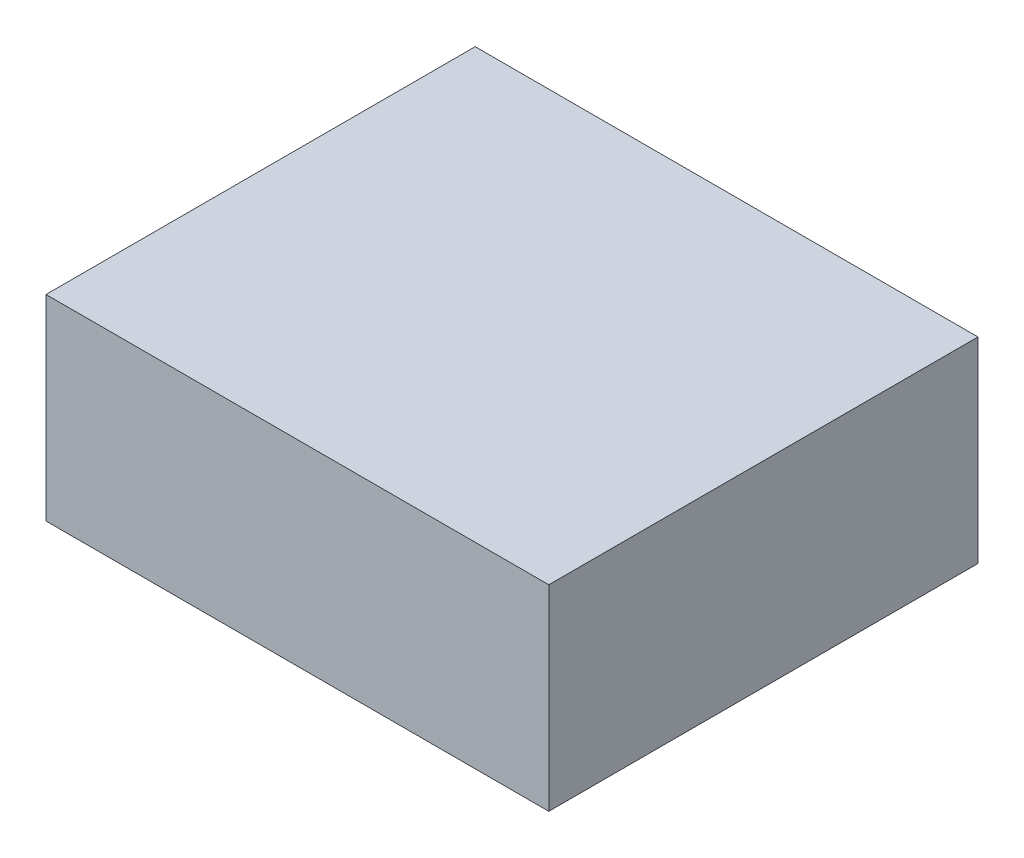
ISO-10303-21;
HEADER;
FILE_DESCRIPTION(('STEP AP214'),'2;1');
FILE_NAME('part.step','',(''),(''),'','','');
FILE_SCHEMA(('AUTOMOTIVE_DESIGN { 1 0 10303 214 1 1 1 1 }'));
ENDSEC;
DATA;
#1=APPLICATION_CONTEXT('core data for automotive mechanical design processes');
#2=APPLICATION_PROTOCOL_DEFINITION('international standard','automotive_design',2000,#1);
#3=PRODUCT_CONTEXT('',#1,'mechanical');
#4=PRODUCT('Part','Part','',(#3));
#5=PRODUCT_RELATED_PRODUCT_CATEGORY('part','',(#4));
#6=PRODUCT_DEFINITION_FORMATION('','',#4);
#7=PRODUCT_DEFINITION_CONTEXT('part definition',#1,'design');
#8=PRODUCT_DEFINITION('design','',#6,#7);
#9=PRODUCT_DEFINITION_SHAPE('','',#8);
#10=(LENGTH_UNIT() NAMED_UNIT(*) SI_UNIT(.MILLI.,.METRE.));
#11=(NAMED_UNIT(*) PLANE_ANGLE_UNIT() SI_UNIT($,.RADIAN.));
#12=(NAMED_UNIT(*) SI_UNIT($,.STERADIAN.) SOLID_ANGLE_UNIT());
#13=UNCERTAINTY_MEASURE_WITH_UNIT(LENGTH_MEASURE(1.E-05),#10,'distance_accuracy_value','');
#14=(GEOMETRIC_REPRESENTATION_CONTEXT(3) GLOBAL_UNCERTAINTY_ASSIGNED_CONTEXT((#13)) GLOBAL_UNIT_ASSIGNED_CONTEXT((#10,
#11,#12)) REPRESENTATION_CONTEXT('',''));
#15=CARTESIAN_POINT('',(0.,0.,0.));
#16=DIRECTION('',(0.,0.,1.));
#17=DIRECTION('',(1.,0.,0.));
#18=AXIS2_PLACEMENT_3D('',#15,#16,#17);
#19=CARTESIAN_POINT('',(0.,16.,0.));
#20=DIRECTION('',(1.,0.,0.));
#21=DIRECTION('',(0.,0.,-1.));
#22=AXIS2_PLACEMENT_3D('',#19,#20,#21);
#23=PLANE('',#22);
#24=DIRECTION('',(0.,0.,1.));
#25=VECTOR('',#24,1.);
#26=CARTESIAN_POINT('',(0.,0.,0.));
#27=LINE('',#26,#25);
#28=CARTESIAN_POINT('',(0.,0.,-35.));
#29=VERTEX_POINT('',#28);
#30=CARTESIAN_POINT('',(0.,0.,0.));
#31=VERTEX_POINT('',#30);
#32=EDGE_CURVE('E107',#29,#31,#27,.T.);
#33=ORIENTED_EDGE('',*,*,#32,.T.);
#34=DIRECTION('',(0.,-1.,0.));
#35=VECTOR('',#34,1.);
#36=CARTESIAN_POINT('',(0.,16.,0.));
#37=LINE('',#36,#35);
#38=CARTESIAN_POINT('',(0.,16.,0.));
#39=VERTEX_POINT('',#38);
#40=EDGE_CURVE('E11',#39,#31,#37,.T.);
#41=ORIENTED_EDGE('',*,*,#40,.F.);
#42=DIRECTION('',(0.,0.,1.));
#43=VECTOR('',#42,1.);
#44=CARTESIAN_POINT('',(0.,16.,0.));
#45=LINE('',#44,#43);
#46=CARTESIAN_POINT('',(0.,16.,-35.));
#47=VERTEX_POINT('',#46);
#48=EDGE_CURVE('E91',#47,#39,#45,.T.);
#49=ORIENTED_EDGE('',*,*,#48,.F.);
#50=DIRECTION('',(0.,-1.,0.));
#51=VECTOR('',#50,1.);
#52=CARTESIAN_POINT('',(0.,16.,-35.));
#53=LINE('',#52,#51);
#54=EDGE_CURVE('E103',#47,#29,#53,.T.);
#55=ORIENTED_EDGE('',*,*,#54,.T.);
#56=EDGE_LOOP('',(#33,#41,#49,#55));
#57=FACE_BOUND('',#56,.T.);
#58=ADVANCED_FACE('F39',(#57),#23,.F.);
#59=CARTESIAN_POINT('',(0.,16.,0.));
#60=DIRECTION('',(0.,0.,-1.));
#61=DIRECTION('',(-1.,0.,0.));
#62=AXIS2_PLACEMENT_3D('',#59,#60,#61);
#63=PLANE('',#62);
#64=DIRECTION('',(1.,0.,0.));
#65=VECTOR('',#64,1.);
#66=CARTESIAN_POINT('',(0.,0.,0.));
#67=LINE('',#66,#65);
#68=CARTESIAN_POINT('',(41.,0.,0.));
#69=VERTEX_POINT('',#68);
#70=EDGE_CURVE('E96',#31,#69,#67,.T.);
#71=ORIENTED_EDGE('',*,*,#70,.T.);
#72=DIRECTION('',(0.,-1.,0.));
#73=VECTOR('',#72,1.);
#74=CARTESIAN_POINT('',(41.,16.,0.));
#75=LINE('',#74,#73);
#76=CARTESIAN_POINT('',(41.,16.,0.));
#77=VERTEX_POINT('',#76);
#78=EDGE_CURVE('E48',#77,#69,#75,.T.);
#79=ORIENTED_EDGE('',*,*,#78,.F.);
#80=DIRECTION('',(1.,0.,0.));
#81=VECTOR('',#80,1.);
#82=CARTESIAN_POINT('',(0.,16.,0.));
#83=LINE('',#82,#81);
#84=EDGE_CURVE('E86',#39,#77,#83,.T.);
#85=ORIENTED_EDGE('',*,*,#84,.F.);
#86=ORIENTED_EDGE('',*,*,#40,.T.);
#87=EDGE_LOOP('',(#71,#79,#85,#86));
#88=FACE_BOUND('',#87,.T.);
#89=ADVANCED_FACE('F95',(#88),#63,.F.);
#90=CARTESIAN_POINT('',(41.,16.,0.));
#91=DIRECTION('',(-1.,0.,0.));
#92=DIRECTION('',(0.,0.,1.));
#93=AXIS2_PLACEMENT_3D('',#90,#91,#92);
#94=PLANE('',#93);
#95=DIRECTION('',(0.,0.,-1.));
#96=VECTOR('',#95,1.);
#97=CARTESIAN_POINT('',(41.,0.,0.));
#98=LINE('',#97,#96);
#99=CARTESIAN_POINT('',(41.,0.,-35.));
#100=VERTEX_POINT('',#99);
#101=EDGE_CURVE('E73',#69,#100,#98,.T.);
#102=ORIENTED_EDGE('',*,*,#101,.T.);
#103=DIRECTION('',(0.,-1.,0.));
#104=VECTOR('',#103,1.);
#105=CARTESIAN_POINT('',(41.,16.,-35.));
#106=LINE('',#105,#104);
#107=CARTESIAN_POINT('',(41.,16.,-35.));
#108=VERTEX_POINT('',#107);
#109=EDGE_CURVE('E98',#108,#100,#106,.T.);
#110=ORIENTED_EDGE('',*,*,#109,.F.);
#111=DIRECTION('',(0.,0.,-1.));
#112=VECTOR('',#111,1.);
#113=CARTESIAN_POINT('',(41.,16.,0.));
#114=LINE('',#113,#112);
#115=EDGE_CURVE('E89',#77,#108,#114,.T.);
#116=ORIENTED_EDGE('',*,*,#115,.F.);
#117=ORIENTED_EDGE('',*,*,#78,.T.);
#118=EDGE_LOOP('',(#102,#110,#116,#117));
#119=FACE_BOUND('',#118,.T.);
#120=ADVANCED_FACE('F99',(#119),#94,.F.);
#121=CARTESIAN_POINT('',(0.,16.,-35.));
#122=DIRECTION('',(0.,0.,1.));
#123=DIRECTION('',(1.,0.,0.));
#124=AXIS2_PLACEMENT_3D('',#121,#122,#123);
#125=PLANE('',#124);
#126=DIRECTION('',(-1.,0.,0.));
#127=VECTOR('',#126,1.);
#128=CARTESIAN_POINT('',(0.,0.,-35.));
#129=LINE('',#128,#127);
#130=EDGE_CURVE('E79',#100,#29,#129,.T.);
#131=ORIENTED_EDGE('',*,*,#130,.T.);
#132=ORIENTED_EDGE('',*,*,#54,.F.);
#133=DIRECTION('',(-1.,0.,0.));
#134=VECTOR('',#133,1.);
#135=CARTESIAN_POINT('',(0.,16.,-35.));
#136=LINE('',#135,#134);
#137=EDGE_CURVE('E56',#108,#47,#136,.T.);
#138=ORIENTED_EDGE('',*,*,#137,.F.);
#139=ORIENTED_EDGE('',*,*,#109,.T.);
#140=EDGE_LOOP('',(#131,#132,#138,#139));
#141=FACE_BOUND('',#140,.T.);
#142=ADVANCED_FACE('F120',(#141),#125,.F.);
#143=CARTESIAN_POINT('',(0.,16.,0.));
#144=DIRECTION('',(0.,-1.,0.));
#145=DIRECTION('',(0.,0.,-1.));
#146=AXIS2_PLACEMENT_3D('',#143,#144,#145);
#147=PLANE('',#146);
#148=ORIENTED_EDGE('',*,*,#48,.T.);
#149=ORIENTED_EDGE('',*,*,#84,.T.);
#150=ORIENTED_EDGE('',*,*,#115,.T.);
#151=ORIENTED_EDGE('',*,*,#137,.T.);
#152=EDGE_LOOP('',(#148,#149,#150,#151));
#153=FACE_BOUND('',#152,.T.);
#154=ADVANCED_FACE('F87',(#153),#147,.F.);
#155=CARTESIAN_POINT('',(0.,0.,0.));
#156=DIRECTION('',(0.,-1.,0.));
#157=DIRECTION('',(0.,0.,-1.));
#158=AXIS2_PLACEMENT_3D('',#155,#156,#157);
#159=PLANE('',#158);
#160=ORIENTED_EDGE('',*,*,#32,.F.);
#161=ORIENTED_EDGE('',*,*,#130,.F.);
#162=ORIENTED_EDGE('',*,*,#101,.F.);
#163=ORIENTED_EDGE('',*,*,#70,.F.);
#164=EDGE_LOOP('',(#160,#161,#162,#163));
#165=FACE_BOUND('',#164,.T.);
#166=ADVANCED_FACE('F123',(#165),#159,.T.);
#167=CLOSED_SHELL('',(#58,#89,#120,#142,#154,#166));
#168=MANIFOLD_SOLID_BREP('B2',#167);
#169=ADVANCED_BREP_SHAPE_REPRESENTATION('',(#18,#168),#14);
#170=SHAPE_DEFINITION_REPRESENTATION(#9,#169);
ENDSEC;
END-ISO-10303-21;
